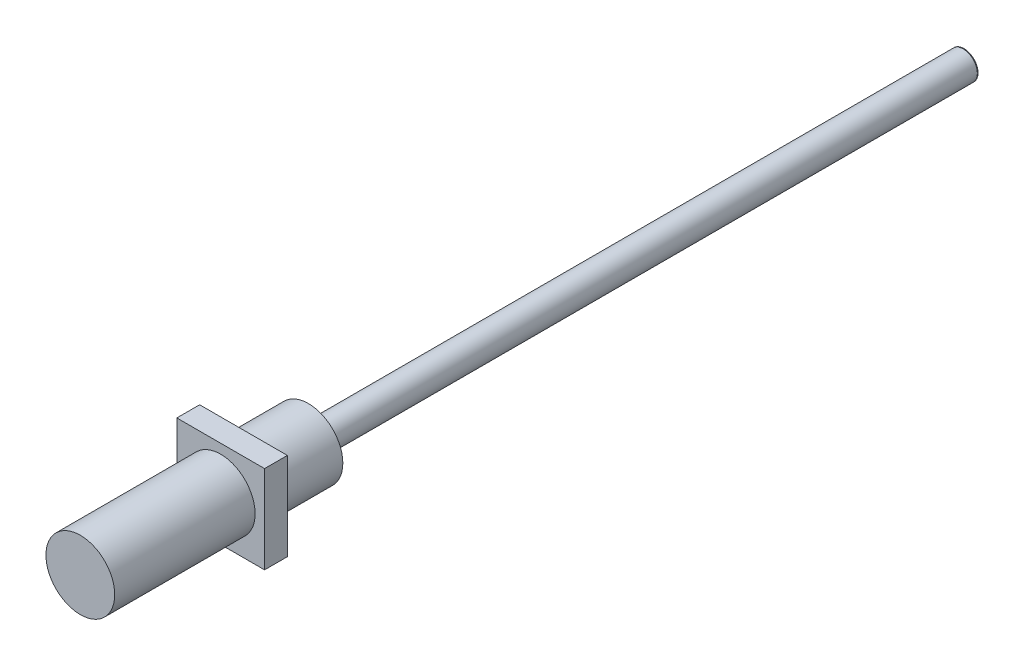
ISO-10303-21;
HEADER;
FILE_DESCRIPTION(('STEP AP214'),'2;1');
FILE_NAME('part.step','',(''),(''),'','','');
FILE_SCHEMA(('AUTOMOTIVE_DESIGN { 1 0 10303 214 1 1 1 1 }'));
ENDSEC;
DATA;
#1=APPLICATION_CONTEXT('core data for automotive mechanical design processes');
#2=APPLICATION_PROTOCOL_DEFINITION('international standard','automotive_design',2000,#1);
#3=PRODUCT_CONTEXT('',#1,'mechanical');
#4=PRODUCT('Part','Part','',(#3));
#5=PRODUCT_RELATED_PRODUCT_CATEGORY('part','',(#4));
#6=PRODUCT_DEFINITION_FORMATION('','',#4);
#7=PRODUCT_DEFINITION_CONTEXT('part definition',#1,'design');
#8=PRODUCT_DEFINITION('design','',#6,#7);
#9=PRODUCT_DEFINITION_SHAPE('','',#8);
#10=(LENGTH_UNIT() NAMED_UNIT(*) SI_UNIT(.MILLI.,.METRE.));
#11=(NAMED_UNIT(*) PLANE_ANGLE_UNIT() SI_UNIT($,.RADIAN.));
#12=(NAMED_UNIT(*) SI_UNIT($,.STERADIAN.) SOLID_ANGLE_UNIT());
#13=UNCERTAINTY_MEASURE_WITH_UNIT(LENGTH_MEASURE(1.E-05),#10,'distance_accuracy_value','');
#14=(GEOMETRIC_REPRESENTATION_CONTEXT(3) GLOBAL_UNCERTAINTY_ASSIGNED_CONTEXT((#13)) GLOBAL_UNIT_ASSIGNED_CONTEXT((#10,
#11,#12)) REPRESENTATION_CONTEXT('',''));
#15=CARTESIAN_POINT('',(0.,0.,0.));
#16=DIRECTION('',(0.,0.,1.));
#17=DIRECTION('',(1.,0.,0.));
#18=AXIS2_PLACEMENT_3D('',#15,#16,#17);
#19=CARTESIAN_POINT('',(0.,0.,47.371));
#20=DIRECTION('',(0.,0.,-1.));
#21=DIRECTION('',(-1.,0.,0.));
#22=AXIS2_PLACEMENT_3D('',#19,#20,#21);
#23=CYLINDRICAL_SURFACE('',#22,1.016);
#24=CARTESIAN_POINT('',(0.,0.,47.371));
#25=DIRECTION('',(0.,0.,1.));
#26=DIRECTION('',(1.,0.,0.));
#27=AXIS2_PLACEMENT_3D('',#24,#25,#26);
#28=CIRCLE('',#27,1.016);
#29=CARTESIAN_POINT('',(1.016,0.,47.371));
#30=VERTEX_POINT('',#29);
#31=EDGE_CURVE('E44',#30,#30,#28,.T.);
#32=ORIENTED_EDGE('',*,*,#31,.F.);
#33=EDGE_LOOP('',(#32));
#34=FACE_BOUND('',#33,.T.);
#35=CARTESIAN_POINT('',(0.,0.,-0.0254));
#36=DIRECTION('',(0.,0.,-1.));
#37=DIRECTION('',(-1.,0.,0.));
#38=AXIS2_PLACEMENT_3D('',#35,#36,#37);
#39=CIRCLE('',#38,1.016);
#40=CARTESIAN_POINT('',(-1.016,0.,-0.0254));
#41=VERTEX_POINT('',#40);
#42=EDGE_CURVE('E176',#41,#41,#39,.T.);
#43=ORIENTED_EDGE('',*,*,#42,.F.);
#44=EDGE_LOOP('',(#43));
#45=FACE_BOUND('',#44,.T.);
#46=ADVANCED_FACE('F41',(#34,#45),#23,.T.);
#47=CARTESIAN_POINT('',(0.,0.,-0.0254));
#48=DIRECTION('',(0.,0.,-1.));
#49=DIRECTION('',(-1.,0.,0.));
#50=AXIS2_PLACEMENT_3D('',#47,#48,#49);
#51=PLANE('',#50);
#52=DIRECTION('',(0.,1.,0.));
#53=VECTOR('',#52,1.);
#54=CARTESIAN_POINT('',(-0.635,0.635,-0.0254));
#55=LINE('',#54,#53);
#56=CARTESIAN_POINT('',(-0.635,-0.635,-0.0254));
#57=VERTEX_POINT('',#56);
#58=CARTESIAN_POINT('',(-0.635,0.635,-0.0254));
#59=VERTEX_POINT('',#58);
#60=EDGE_CURVE('E56',#57,#59,#55,.T.);
#61=ORIENTED_EDGE('',*,*,#60,.F.);
#62=DIRECTION('',(-1.,0.,0.));
#63=VECTOR('',#62,1.);
#64=CARTESIAN_POINT('',(0.635,-0.635,-0.0254));
#65=LINE('',#64,#63);
#66=CARTESIAN_POINT('',(0.635,-0.635,-0.0254));
#67=VERTEX_POINT('',#66);
#68=EDGE_CURVE('E60',#67,#57,#65,.T.);
#69=ORIENTED_EDGE('',*,*,#68,.F.);
#70=DIRECTION('',(0.,-1.,0.));
#71=VECTOR('',#70,1.);
#72=CARTESIAN_POINT('',(0.635,0.635,-0.0254));
#73=LINE('',#72,#71);
#74=CARTESIAN_POINT('',(0.635,0.635,-0.0254));
#75=VERTEX_POINT('',#74);
#76=EDGE_CURVE('E163',#75,#67,#73,.T.);
#77=ORIENTED_EDGE('',*,*,#76,.F.);
#78=DIRECTION('',(1.,0.,0.));
#79=VECTOR('',#78,1.);
#80=CARTESIAN_POINT('',(0.635,0.635,-0.0254));
#81=LINE('',#80,#79);
#82=EDGE_CURVE('E160',#59,#75,#81,.T.);
#83=ORIENTED_EDGE('',*,*,#82,.F.);
#84=EDGE_LOOP('',(#61,#69,#77,#83));
#85=FACE_BOUND('',#84,.T.);
#86=ORIENTED_EDGE('',*,*,#42,.T.);
#87=EDGE_LOOP('',(#86));
#88=FACE_BOUND('',#87,.T.);
#89=ADVANCED_FACE('F188',(#85,#88),#51,.T.);
#90=CARTESIAN_POINT('',(-0.635,0.635,-0.0508));
#91=DIRECTION('',(1.,0.,0.));
#92=DIRECTION('',(0.,1.,0.));
#93=AXIS2_PLACEMENT_3D('',#90,#91,#92);
#94=PLANE('',#93);
#95=ORIENTED_EDGE('',*,*,#60,.T.);
#96=DIRECTION('',(0.,0.,1.));
#97=VECTOR('',#96,1.);
#98=CARTESIAN_POINT('',(-0.635,0.635,-0.0508));
#99=LINE('',#98,#97);
#100=CARTESIAN_POINT('',(-0.635,0.635,-0.0508));
#101=VERTEX_POINT('',#100);
#102=EDGE_CURVE('E174',#101,#59,#99,.T.);
#103=ORIENTED_EDGE('',*,*,#102,.F.);
#104=DIRECTION('',(0.,1.,0.));
#105=VECTOR('',#104,1.);
#106=CARTESIAN_POINT('',(-0.635,0.635,-0.0508));
#107=LINE('',#106,#105);
#108=CARTESIAN_POINT('',(-0.635,-0.635,-0.0508));
#109=VERTEX_POINT('',#108);
#110=EDGE_CURVE('E146',#109,#101,#107,.T.);
#111=ORIENTED_EDGE('',*,*,#110,.F.);
#112=DIRECTION('',(0.,0.,1.));
#113=VECTOR('',#112,1.);
#114=CARTESIAN_POINT('',(-0.635,-0.635,-0.0508));
#115=LINE('',#114,#113);
#116=EDGE_CURVE('E158',#109,#57,#115,.T.);
#117=ORIENTED_EDGE('',*,*,#116,.T.);
#118=EDGE_LOOP('',(#95,#103,#111,#117));
#119=FACE_BOUND('',#118,.T.);
#120=ADVANCED_FACE('F192',(#119),#94,.F.);
#121=CARTESIAN_POINT('',(0.635,0.635,-0.0508));
#122=DIRECTION('',(0.,-1.,0.));
#123=DIRECTION('',(0.,0.,-1.));
#124=AXIS2_PLACEMENT_3D('',#121,#122,#123);
#125=PLANE('',#124);
#126=ORIENTED_EDGE('',*,*,#82,.T.);
#127=DIRECTION('',(0.,0.,1.));
#128=VECTOR('',#127,1.);
#129=CARTESIAN_POINT('',(0.635,0.635,-0.0508));
#130=LINE('',#129,#128);
#131=CARTESIAN_POINT('',(0.635,0.635,-0.0508));
#132=VERTEX_POINT('',#131);
#133=EDGE_CURVE('E171',#132,#75,#130,.T.);
#134=ORIENTED_EDGE('',*,*,#133,.F.);
#135=DIRECTION('',(1.,0.,0.));
#136=VECTOR('',#135,1.);
#137=CARTESIAN_POINT('',(0.635,0.635,-0.0508));
#138=LINE('',#137,#136);
#139=EDGE_CURVE('E149',#101,#132,#138,.T.);
#140=ORIENTED_EDGE('',*,*,#139,.F.);
#141=ORIENTED_EDGE('',*,*,#102,.T.);
#142=EDGE_LOOP('',(#126,#134,#140,#141));
#143=FACE_BOUND('',#142,.T.);
#144=ADVANCED_FACE('F196',(#143),#125,.F.);
#145=CARTESIAN_POINT('',(0.635,0.635,-0.0508));
#146=DIRECTION('',(-1.,0.,0.));
#147=DIRECTION('',(0.,-1.,0.));
#148=AXIS2_PLACEMENT_3D('',#145,#146,#147);
#149=PLANE('',#148);
#150=ORIENTED_EDGE('',*,*,#76,.T.);
#151=DIRECTION('',(0.,0.,1.));
#152=VECTOR('',#151,1.);
#153=CARTESIAN_POINT('',(0.635,-0.635,-0.0508));
#154=LINE('',#153,#152);
#155=CARTESIAN_POINT('',(0.635,-0.635,-0.0508));
#156=VERTEX_POINT('',#155);
#157=EDGE_CURVE('E168',#156,#67,#154,.T.);
#158=ORIENTED_EDGE('',*,*,#157,.F.);
#159=DIRECTION('',(0.,-1.,0.));
#160=VECTOR('',#159,1.);
#161=CARTESIAN_POINT('',(0.635,0.635,-0.0508));
#162=LINE('',#161,#160);
#163=EDGE_CURVE('E152',#132,#156,#162,.T.);
#164=ORIENTED_EDGE('',*,*,#163,.F.);
#165=ORIENTED_EDGE('',*,*,#133,.T.);
#166=EDGE_LOOP('',(#150,#158,#164,#165));
#167=FACE_BOUND('',#166,.T.);
#168=ADVANCED_FACE('F202',(#167),#149,.F.);
#169=CARTESIAN_POINT('',(0.635,-0.635,-0.0508));
#170=DIRECTION('',(0.,1.,0.));
#171=DIRECTION('',(0.,0.,1.));
#172=AXIS2_PLACEMENT_3D('',#169,#170,#171);
#173=PLANE('',#172);
#174=ORIENTED_EDGE('',*,*,#68,.T.);
#175=ORIENTED_EDGE('',*,*,#116,.F.);
#176=DIRECTION('',(-1.,0.,0.));
#177=VECTOR('',#176,1.);
#178=CARTESIAN_POINT('',(0.635,-0.635,-0.0508));
#179=LINE('',#178,#177);
#180=EDGE_CURVE('E155',#156,#109,#179,.T.);
#181=ORIENTED_EDGE('',*,*,#180,.F.);
#182=ORIENTED_EDGE('',*,*,#157,.T.);
#183=EDGE_LOOP('',(#174,#175,#181,#182));
#184=FACE_BOUND('',#183,.T.);
#185=ADVANCED_FACE('F206',(#184),#173,.F.);
#186=CARTESIAN_POINT('',(0.,0.,-0.0508));
#187=DIRECTION('',(0.,0.,-1.));
#188=DIRECTION('',(-1.,0.,0.));
#189=AXIS2_PLACEMENT_3D('',#186,#187,#188);
#190=PLANE('',#189);
#191=CARTESIAN_POINT('',(0.,0.,-0.0508));
#192=DIRECTION('',(0.,0.,-1.));
#193=DIRECTION('',(-1.,0.,0.));
#194=AXIS2_PLACEMENT_3D('',#191,#192,#193);
#195=CIRCLE('',#194,1.016);
#196=CARTESIAN_POINT('',(-1.016,0.,-0.0508));
#197=VERTEX_POINT('',#196);
#198=EDGE_CURVE('E139',#197,#197,#195,.T.);
#199=ORIENTED_EDGE('',*,*,#198,.F.);
#200=EDGE_LOOP('',(#199));
#201=FACE_BOUND('',#200,.T.);
#202=ORIENTED_EDGE('',*,*,#180,.T.);
#203=ORIENTED_EDGE('',*,*,#110,.T.);
#204=ORIENTED_EDGE('',*,*,#139,.T.);
#205=ORIENTED_EDGE('',*,*,#163,.T.);
#206=EDGE_LOOP('',(#202,#203,#204,#205));
#207=FACE_BOUND('',#206,.T.);
#208=ADVANCED_FACE('F210',(#201,#207),#190,.F.);
#209=CARTESIAN_POINT('',(0.,0.,-0.0762));
#210=DIRECTION('',(0.,0.,1.));
#211=DIRECTION('',(1.,0.,0.));
#212=AXIS2_PLACEMENT_3D('',#209,#210,#211);
#213=CYLINDRICAL_SURFACE('',#212,1.016);
#214=CARTESIAN_POINT('',(0.,0.,-0.0762));
#215=DIRECTION('',(0.,0.,-1.));
#216=DIRECTION('',(-1.,0.,0.));
#217=AXIS2_PLACEMENT_3D('',#214,#215,#216);
#218=CIRCLE('',#217,1.016);
#219=CARTESIAN_POINT('',(-1.016,0.,-0.0762));
#220=VERTEX_POINT('',#219);
#221=EDGE_CURVE('E141',#220,#220,#218,.T.);
#222=ORIENTED_EDGE('',*,*,#221,.F.);
#223=EDGE_LOOP('',(#222));
#224=FACE_BOUND('',#223,.T.);
#225=ORIENTED_EDGE('',*,*,#198,.T.);
#226=EDGE_LOOP('',(#225));
#227=FACE_BOUND('',#226,.T.);
#228=ADVANCED_FACE('F212',(#224,#227),#213,.T.);
#229=CARTESIAN_POINT('',(0.,0.,-0.0762));
#230=DIRECTION('',(0.,0.,-1.));
#231=DIRECTION('',(-1.,0.,0.));
#232=AXIS2_PLACEMENT_3D('',#229,#230,#231);
#233=PLANE('',#232);
#234=ORIENTED_EDGE('',*,*,#221,.T.);
#235=EDGE_LOOP('',(#234));
#236=FACE_BOUND('',#235,.T.);
#237=ADVANCED_FACE('F215',(#236),#233,.T.);
#238=CARTESIAN_POINT('',(0.,0.,52.07));
#239=DIRECTION('',(0.,0.,-1.));
#240=DIRECTION('',(-1.,0.,0.));
#241=AXIS2_PLACEMENT_3D('',#238,#239,#240);
#242=CYLINDRICAL_SURFACE('',#241,2.4892);
#243=CARTESIAN_POINT('',(0.,0.,52.07));
#244=DIRECTION('',(0.,0.,1.));
#245=DIRECTION('',(1.,0.,0.));
#246=AXIS2_PLACEMENT_3D('',#243,#244,#245);
#247=CIRCLE('',#246,2.4892);
#248=CARTESIAN_POINT('',(2.4892,0.,52.07));
#249=VERTEX_POINT('',#248);
#250=EDGE_CURVE('E132',#249,#249,#247,.T.);
#251=ORIENTED_EDGE('',*,*,#250,.F.);
#252=EDGE_LOOP('',(#251));
#253=FACE_BOUND('',#252,.T.);
#254=CARTESIAN_POINT('',(0.,0.,47.371));
#255=DIRECTION('',(0.,0.,1.));
#256=DIRECTION('',(1.,0.,0.));
#257=AXIS2_PLACEMENT_3D('',#254,#255,#256);
#258=CIRCLE('',#257,2.4892);
#259=CARTESIAN_POINT('',(2.4892,0.,47.371));
#260=VERTEX_POINT('',#259);
#261=EDGE_CURVE('E129',#260,#260,#258,.T.);
#262=ORIENTED_EDGE('',*,*,#261,.T.);
#263=EDGE_LOOP('',(#262));
#264=FACE_BOUND('',#263,.T.);
#265=ADVANCED_FACE('F222',(#253,#264),#242,.T.);
#266=CARTESIAN_POINT('',(0.,0.,47.371));
#267=DIRECTION('',(0.,0.,1.));
#268=DIRECTION('',(1.,0.,0.));
#269=AXIS2_PLACEMENT_3D('',#266,#267,#268);
#270=PLANE('',#269);
#271=ORIENTED_EDGE('',*,*,#31,.T.);
#272=EDGE_LOOP('',(#271));
#273=FACE_BOUND('',#272,.T.);
#274=ORIENTED_EDGE('',*,*,#261,.F.);
#275=EDGE_LOOP('',(#274));
#276=FACE_BOUND('',#275,.T.);
#277=ADVANCED_FACE('F183',(#273,#276),#270,.F.);
#278=CARTESIAN_POINT('',(3.175,3.175,53.721));
#279=DIRECTION('',(-1.,0.,0.));
#280=DIRECTION('',(0.,-1.,0.));
#281=AXIS2_PLACEMENT_3D('',#278,#279,#280);
#282=PLANE('',#281);
#283=DIRECTION('',(0.,1.,0.));
#284=VECTOR('',#283,1.);
#285=CARTESIAN_POINT('',(3.175,3.175,52.07));
#286=LINE('',#285,#284);
#287=CARTESIAN_POINT('',(3.175,-3.175,52.07));
#288=VERTEX_POINT('',#287);
#289=CARTESIAN_POINT('',(3.175,3.175,52.07));
#290=VERTEX_POINT('',#289);
#291=EDGE_CURVE('E128',#288,#290,#286,.T.);
#292=ORIENTED_EDGE('',*,*,#291,.T.);
#293=DIRECTION('',(0.,0.,-1.));
#294=VECTOR('',#293,1.);
#295=CARTESIAN_POINT('',(3.175,3.175,53.721));
#296=LINE('',#295,#294);
#297=CARTESIAN_POINT('',(3.175,3.175,53.721));
#298=VERTEX_POINT('',#297);
#299=EDGE_CURVE('E108',#298,#290,#296,.T.);
#300=ORIENTED_EDGE('',*,*,#299,.F.);
#301=DIRECTION('',(0.,1.,0.));
#302=VECTOR('',#301,1.);
#303=CARTESIAN_POINT('',(3.175,3.175,53.721));
#304=LINE('',#303,#302);
#305=CARTESIAN_POINT('',(3.175,-3.175,53.721));
#306=VERTEX_POINT('',#305);
#307=EDGE_CURVE('E115',#306,#298,#304,.T.);
#308=ORIENTED_EDGE('',*,*,#307,.F.);
#309=DIRECTION('',(0.,0.,-1.));
#310=VECTOR('',#309,1.);
#311=CARTESIAN_POINT('',(3.175,-3.175,53.721));
#312=LINE('',#311,#310);
#313=EDGE_CURVE('E265',#306,#288,#312,.T.);
#314=ORIENTED_EDGE('',*,*,#313,.T.);
#315=EDGE_LOOP('',(#292,#300,#308,#314));
#316=FACE_BOUND('',#315,.T.);
#317=ADVANCED_FACE('F126',(#316),#282,.F.);
#318=CARTESIAN_POINT('',(-3.175,3.175,53.721));
#319=DIRECTION('',(0.,-1.,0.));
#320=DIRECTION('',(0.,0.,-1.));
#321=AXIS2_PLACEMENT_3D('',#318,#319,#320);
#322=PLANE('',#321);
#323=DIRECTION('',(-1.,0.,0.));
#324=VECTOR('',#323,1.);
#325=CARTESIAN_POINT('',(-3.175,3.175,52.07));
#326=LINE('',#325,#324);
#327=CARTESIAN_POINT('',(-3.175,3.175,52.07));
#328=VERTEX_POINT('',#327);
#329=EDGE_CURVE('E261',#290,#328,#326,.T.);
#330=ORIENTED_EDGE('',*,*,#329,.T.);
#331=DIRECTION('',(0.,0.,-1.));
#332=VECTOR('',#331,1.);
#333=CARTESIAN_POINT('',(-3.175,3.175,53.721));
#334=LINE('',#333,#332);
#335=CARTESIAN_POINT('',(-3.175,3.175,53.721));
#336=VERTEX_POINT('',#335);
#337=EDGE_CURVE('E111',#336,#328,#334,.T.);
#338=ORIENTED_EDGE('',*,*,#337,.F.);
#339=DIRECTION('',(-1.,0.,0.));
#340=VECTOR('',#339,1.);
#341=CARTESIAN_POINT('',(-3.175,3.175,53.721));
#342=LINE('',#341,#340);
#343=EDGE_CURVE('E104',#298,#336,#342,.T.);
#344=ORIENTED_EDGE('',*,*,#343,.F.);
#345=ORIENTED_EDGE('',*,*,#299,.T.);
#346=EDGE_LOOP('',(#330,#338,#344,#345));
#347=FACE_BOUND('',#346,.T.);
#348=ADVANCED_FACE('F106',(#347),#322,.F.);
#349=CARTESIAN_POINT('',(-3.175,3.175,53.721));
#350=DIRECTION('',(1.,0.,0.));
#351=DIRECTION('',(0.,1.,0.));
#352=AXIS2_PLACEMENT_3D('',#349,#350,#351);
#353=PLANE('',#352);
#354=DIRECTION('',(0.,-1.,0.));
#355=VECTOR('',#354,1.);
#356=CARTESIAN_POINT('',(-3.175,3.175,52.07));
#357=LINE('',#356,#355);
#358=CARTESIAN_POINT('',(-3.175,-3.175,52.07));
#359=VERTEX_POINT('',#358);
#360=EDGE_CURVE('E268',#328,#359,#357,.T.);
#361=ORIENTED_EDGE('',*,*,#360,.T.);
#362=DIRECTION('',(0.,0.,-1.));
#363=VECTOR('',#362,1.);
#364=CARTESIAN_POINT('',(-3.175,-3.175,53.721));
#365=LINE('',#364,#363);
#366=CARTESIAN_POINT('',(-3.175,-3.175,53.721));
#367=VERTEX_POINT('',#366);
#368=EDGE_CURVE('E134',#367,#359,#365,.T.);
#369=ORIENTED_EDGE('',*,*,#368,.F.);
#370=DIRECTION('',(0.,-1.,0.));
#371=VECTOR('',#370,1.);
#372=CARTESIAN_POINT('',(-3.175,3.175,53.721));
#373=LINE('',#372,#371);
#374=EDGE_CURVE('E114',#336,#367,#373,.T.);
#375=ORIENTED_EDGE('',*,*,#374,.F.);
#376=ORIENTED_EDGE('',*,*,#337,.T.);
#377=EDGE_LOOP('',(#361,#369,#375,#376));
#378=FACE_BOUND('',#377,.T.);
#379=ADVANCED_FACE('F233',(#378),#353,.F.);
#380=CARTESIAN_POINT('',(-3.175,-3.175,53.721));
#381=DIRECTION('',(0.,1.,0.));
#382=DIRECTION('',(0.,0.,1.));
#383=AXIS2_PLACEMENT_3D('',#380,#381,#382);
#384=PLANE('',#383);
#385=DIRECTION('',(1.,0.,0.));
#386=VECTOR('',#385,1.);
#387=CARTESIAN_POINT('',(-3.175,-3.175,52.07));
#388=LINE('',#387,#386);
#389=EDGE_CURVE('E124',#359,#288,#388,.T.);
#390=ORIENTED_EDGE('',*,*,#389,.T.);
#391=ORIENTED_EDGE('',*,*,#313,.F.);
#392=DIRECTION('',(1.,0.,0.));
#393=VECTOR('',#392,1.);
#394=CARTESIAN_POINT('',(-3.175,-3.175,53.721));
#395=LINE('',#394,#393);
#396=EDGE_CURVE('E120',#367,#306,#395,.T.);
#397=ORIENTED_EDGE('',*,*,#396,.F.);
#398=ORIENTED_EDGE('',*,*,#368,.T.);
#399=EDGE_LOOP('',(#390,#391,#397,#398));
#400=FACE_BOUND('',#399,.T.);
#401=ADVANCED_FACE('F236',(#400),#384,.F.);
#402=CARTESIAN_POINT('',(0.,0.,53.721));
#403=DIRECTION('',(0.,0.,1.));
#404=DIRECTION('',(1.,0.,0.));
#405=AXIS2_PLACEMENT_3D('',#402,#403,#404);
#406=PLANE('',#405);
#407=CARTESIAN_POINT('',(0.,0.,53.721));
#408=DIRECTION('',(0.,0.,1.));
#409=DIRECTION('',(1.,0.,0.));
#410=AXIS2_PLACEMENT_3D('',#407,#408,#409);
#411=CIRCLE('',#410,2.4892);
#412=CARTESIAN_POINT('',(2.4892,0.,53.721));
#413=VERTEX_POINT('',#412);
#414=EDGE_CURVE('E11',#413,#413,#411,.T.);
#415=ORIENTED_EDGE('',*,*,#414,.F.);
#416=EDGE_LOOP('',(#415));
#417=FACE_BOUND('',#416,.T.);
#418=ORIENTED_EDGE('',*,*,#307,.T.);
#419=ORIENTED_EDGE('',*,*,#343,.T.);
#420=ORIENTED_EDGE('',*,*,#374,.T.);
#421=ORIENTED_EDGE('',*,*,#396,.T.);
#422=EDGE_LOOP('',(#418,#419,#420,#421));
#423=FACE_BOUND('',#422,.T.);
#424=ADVANCED_FACE('F118',(#417,#423),#406,.T.);
#425=CARTESIAN_POINT('',(0.,0.,52.07));
#426=DIRECTION('',(0.,0.,1.));
#427=DIRECTION('',(1.,0.,0.));
#428=AXIS2_PLACEMENT_3D('',#425,#426,#427);
#429=PLANE('',#428);
#430=ORIENTED_EDGE('',*,*,#250,.T.);
#431=EDGE_LOOP('',(#430));
#432=FACE_BOUND('',#431,.T.);
#433=ORIENTED_EDGE('',*,*,#291,.F.);
#434=ORIENTED_EDGE('',*,*,#389,.F.);
#435=ORIENTED_EDGE('',*,*,#360,.F.);
#436=ORIENTED_EDGE('',*,*,#329,.F.);
#437=EDGE_LOOP('',(#433,#434,#435,#436));
#438=FACE_BOUND('',#437,.T.);
#439=ADVANCED_FACE('F241',(#432,#438),#429,.F.);
#440=CARTESIAN_POINT('',(0.,0.,63.881));
#441=DIRECTION('',(0.,0.,-1.));
#442=DIRECTION('',(-1.,0.,0.));
#443=AXIS2_PLACEMENT_3D('',#440,#441,#442);
#444=CYLINDRICAL_SURFACE('',#443,2.4892);
#445=CARTESIAN_POINT('',(0.,0.,63.881));
#446=DIRECTION('',(0.,0.,1.));
#447=DIRECTION('',(1.,0.,0.));
#448=AXIS2_PLACEMENT_3D('',#445,#446,#447);
#449=CIRCLE('',#448,2.4892);
#450=CARTESIAN_POINT('',(2.4892,0.,63.881));
#451=VERTEX_POINT('',#450);
#452=EDGE_CURVE('E259',#451,#451,#449,.T.);
#453=ORIENTED_EDGE('',*,*,#452,.F.);
#454=EDGE_LOOP('',(#453));
#455=FACE_BOUND('',#454,.T.);
#456=ORIENTED_EDGE('',*,*,#414,.T.);
#457=EDGE_LOOP('',(#456));
#458=FACE_BOUND('',#457,.T.);
#459=ADVANCED_FACE('F244',(#455,#458),#444,.T.);
#460=CARTESIAN_POINT('',(0.,0.,63.881));
#461=DIRECTION('',(0.,0.,1.));
#462=DIRECTION('',(1.,0.,0.));
#463=AXIS2_PLACEMENT_3D('',#460,#461,#462);
#464=PLANE('',#463);
#465=ORIENTED_EDGE('',*,*,#452,.T.);
#466=EDGE_LOOP('',(#465));
#467=FACE_BOUND('',#466,.T.);
#468=ADVANCED_FACE('F251',(#467),#464,.T.);
#469=CLOSED_SHELL('',(#46,#89,#120,#144,#168,#185,#208,#228,#237,#265,#277,#317,#348,#379,#401,
#424,#439,#459,#468));
#470=MANIFOLD_SOLID_BREP('B2',#469);
#471=ADVANCED_BREP_SHAPE_REPRESENTATION('',(#18,#470),#14);
#472=SHAPE_DEFINITION_REPRESENTATION(#9,#471);
ENDSEC;
END-ISO-10303-21;
